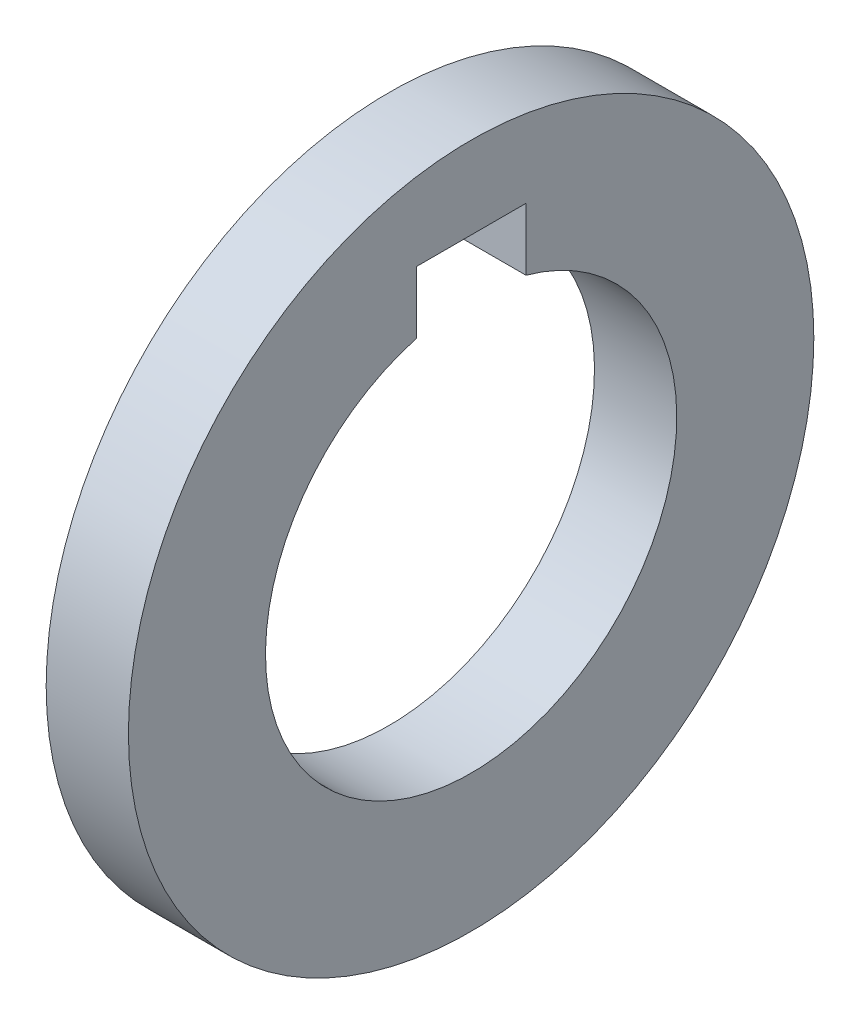
ISO-10303-21;
HEADER;
FILE_DESCRIPTION(('STEP AP214'),'2;1');
FILE_NAME('part.step','',(''),(''),'','','');
FILE_SCHEMA(('AUTOMOTIVE_DESIGN { 1 0 10303 214 1 1 1 1 }'));
ENDSEC;
DATA;
#1=APPLICATION_CONTEXT('core data for automotive mechanical design processes');
#2=APPLICATION_PROTOCOL_DEFINITION('international standard','automotive_design',2000,#1);
#3=PRODUCT_CONTEXT('',#1,'mechanical');
#4=PRODUCT('Part','Part','',(#3));
#5=PRODUCT_RELATED_PRODUCT_CATEGORY('part','',(#4));
#6=PRODUCT_DEFINITION_FORMATION('','',#4);
#7=PRODUCT_DEFINITION_CONTEXT('part definition',#1,'design');
#8=PRODUCT_DEFINITION('design','',#6,#7);
#9=PRODUCT_DEFINITION_SHAPE('','',#8);
#10=(LENGTH_UNIT() NAMED_UNIT(*) SI_UNIT(.MILLI.,.METRE.));
#11=(NAMED_UNIT(*) PLANE_ANGLE_UNIT() SI_UNIT($,.RADIAN.));
#12=(NAMED_UNIT(*) SI_UNIT($,.STERADIAN.) SOLID_ANGLE_UNIT());
#13=UNCERTAINTY_MEASURE_WITH_UNIT(LENGTH_MEASURE(1.E-05),#10,'distance_accuracy_value','');
#14=(GEOMETRIC_REPRESENTATION_CONTEXT(3) GLOBAL_UNCERTAINTY_ASSIGNED_CONTEXT((#13)) GLOBAL_UNIT_ASSIGNED_CONTEXT((#10,
#11,#12)) REPRESENTATION_CONTEXT('',''));
#15=CARTESIAN_POINT('',(0.,0.,0.));
#16=DIRECTION('',(0.,0.,1.));
#17=DIRECTION('',(1.,0.,0.));
#18=AXIS2_PLACEMENT_3D('',#15,#16,#17);
#19=CARTESIAN_POINT('',(3.,0.,0.));
#20=DIRECTION('',(1.,0.,0.));
#21=DIRECTION('',(0.,0.,-1.));
#22=AXIS2_PLACEMENT_3D('',#19,#20,#21);
#23=PLANE('',#22);
#24=DIRECTION('',(0.,-1.,0.));
#25=VECTOR('',#24,1.);
#26=CARTESIAN_POINT('',(3.,0.,2.));
#27=LINE('',#26,#25);
#28=CARTESIAN_POINT('',(3.,9.5,2.));
#29=VERTEX_POINT('',#28);
#30=CARTESIAN_POINT('',(3.,7.22841614740048,2.));
#31=VERTEX_POINT('',#30);
#32=EDGE_CURVE('E59',#29,#31,#27,.T.);
#33=ORIENTED_EDGE('',*,*,#32,.F.);
#34=DIRECTION('',(0.,0.,1.));
#35=VECTOR('',#34,1.);
#36=CARTESIAN_POINT('',(3.,9.5,0.));
#37=LINE('',#36,#35);
#38=CARTESIAN_POINT('',(3.,9.5,-2.));
#39=VERTEX_POINT('',#38);
#40=EDGE_CURVE('E103',#39,#29,#37,.T.);
#41=ORIENTED_EDGE('',*,*,#40,.F.);
#42=DIRECTION('',(0.,1.,0.));
#43=VECTOR('',#42,1.);
#44=CARTESIAN_POINT('',(3.,0.,-2.));
#45=LINE('',#44,#43);
#46=CARTESIAN_POINT('',(3.,7.22841614740048,-2.));
#47=VERTEX_POINT('',#46);
#48=EDGE_CURVE('E80',#47,#39,#45,.T.);
#49=ORIENTED_EDGE('',*,*,#48,.F.);
#50=CARTESIAN_POINT('',(3.,0.,0.));
#51=DIRECTION('',(1.,0.,0.));
#52=DIRECTION('',(0.,0.,-1.));
#53=AXIS2_PLACEMENT_3D('',#50,#51,#52);
#54=CIRCLE('',#53,7.5);
#55=EDGE_CURVE('E105',#31,#47,#54,.T.);
#56=ORIENTED_EDGE('',*,*,#55,.F.);
#57=EDGE_LOOP('',(#33,#41,#49,#56));
#58=FACE_BOUND('',#57,.T.);
#59=CARTESIAN_POINT('',(3.,0.,0.));
#60=DIRECTION('',(1.,0.,0.));
#61=DIRECTION('',(0.,0.,-1.));
#62=AXIS2_PLACEMENT_3D('',#59,#60,#61);
#63=CIRCLE('',#62,12.5);
#64=CARTESIAN_POINT('',(3.,0.,-12.5));
#65=VERTEX_POINT('',#64);
#66=EDGE_CURVE('E110',#65,#65,#63,.T.);
#67=ORIENTED_EDGE('',*,*,#66,.T.);
#68=EDGE_LOOP('',(#67));
#69=FACE_BOUND('',#68,.T.);
#70=ADVANCED_FACE('F37',(#58,#69),#23,.T.);
#71=CARTESIAN_POINT('',(0.,0.,0.));
#72=DIRECTION('',(1.,0.,0.));
#73=DIRECTION('',(0.,0.,-1.));
#74=AXIS2_PLACEMENT_3D('',#71,#72,#73);
#75=PLANE('',#74);
#76=CARTESIAN_POINT('',(0.,0.,0.));
#77=DIRECTION('',(1.,0.,0.));
#78=DIRECTION('',(0.,0.,-1.));
#79=AXIS2_PLACEMENT_3D('',#76,#77,#78);
#80=CIRCLE('',#79,12.5);
#81=CARTESIAN_POINT('',(0.,0.,-12.5));
#82=VERTEX_POINT('',#81);
#83=EDGE_CURVE('E108',#82,#82,#80,.T.);
#84=ORIENTED_EDGE('',*,*,#83,.F.);
#85=EDGE_LOOP('',(#84));
#86=FACE_BOUND('',#85,.T.);
#87=DIRECTION('',(0.,0.,-1.));
#88=VECTOR('',#87,1.);
#89=CARTESIAN_POINT('',(0.,9.5,-2.));
#90=LINE('',#89,#88);
#91=CARTESIAN_POINT('',(0.,9.5,2.));
#92=VERTEX_POINT('',#91);
#93=CARTESIAN_POINT('',(0.,9.5,-2.));
#94=VERTEX_POINT('',#93);
#95=EDGE_CURVE('E87',#92,#94,#90,.T.);
#96=ORIENTED_EDGE('',*,*,#95,.F.);
#97=DIRECTION('',(0.,1.,0.));
#98=VECTOR('',#97,1.);
#99=CARTESIAN_POINT('',(0.,9.5,2.));
#100=LINE('',#99,#98);
#101=CARTESIAN_POINT('',(0.,7.22841614740048,2.));
#102=VERTEX_POINT('',#101);
#103=EDGE_CURVE('E84',#102,#92,#100,.T.);
#104=ORIENTED_EDGE('',*,*,#103,.F.);
#105=CARTESIAN_POINT('',(0.,0.,0.));
#106=DIRECTION('',(1.,0.,0.));
#107=DIRECTION('',(0.,0.,-1.));
#108=AXIS2_PLACEMENT_3D('',#105,#106,#107);
#109=CIRCLE('',#108,7.5);
#110=CARTESIAN_POINT('',(0.,7.22841614740048,-2.));
#111=VERTEX_POINT('',#110);
#112=EDGE_CURVE('E96',#102,#111,#109,.T.);
#113=ORIENTED_EDGE('',*,*,#112,.T.);
#114=DIRECTION('',(0.,-1.,0.));
#115=VECTOR('',#114,1.);
#116=CARTESIAN_POINT('',(0.,9.5,-2.));
#117=LINE('',#116,#115);
#118=EDGE_CURVE('E52',#94,#111,#117,.T.);
#119=ORIENTED_EDGE('',*,*,#118,.F.);
#120=EDGE_LOOP('',(#96,#104,#113,#119));
#121=FACE_BOUND('',#120,.T.);
#122=ADVANCED_FACE('F94',(#86,#121),#75,.F.);
#123=CARTESIAN_POINT('',(3.,0.,0.));
#124=DIRECTION('',(-1.,0.,0.));
#125=DIRECTION('',(0.,0.,1.));
#126=AXIS2_PLACEMENT_3D('',#123,#124,#125);
#127=CYLINDRICAL_SURFACE('',#126,12.5);
#128=ORIENTED_EDGE('',*,*,#66,.F.);
#129=EDGE_LOOP('',(#128));
#130=FACE_BOUND('',#129,.T.);
#131=ORIENTED_EDGE('',*,*,#83,.T.);
#132=EDGE_LOOP('',(#131));
#133=FACE_BOUND('',#132,.T.);
#134=ADVANCED_FACE('F39',(#130,#133),#127,.T.);
#135=CARTESIAN_POINT('',(3.,0.,0.));
#136=DIRECTION('',(-1.,0.,0.));
#137=DIRECTION('',(0.,0.,1.));
#138=AXIS2_PLACEMENT_3D('',#135,#136,#137);
#139=CYLINDRICAL_SURFACE('',#138,7.5);
#140=DIRECTION('',(-1.,0.,0.));
#141=VECTOR('',#140,1.);
#142=CARTESIAN_POINT('',(3.,7.22841614740048,2.));
#143=LINE('',#142,#141);
#144=EDGE_CURVE('E11',#31,#102,#143,.T.);
#145=ORIENTED_EDGE('',*,*,#144,.F.);
#146=ORIENTED_EDGE('',*,*,#55,.T.);
#147=DIRECTION('',(-1.,0.,0.));
#148=VECTOR('',#147,1.);
#149=CARTESIAN_POINT('',(3.,7.22841614740048,-2.));
#150=LINE('',#149,#148);
#151=EDGE_CURVE('E45',#111,#47,#150,.F.);
#152=ORIENTED_EDGE('',*,*,#151,.F.);
#153=ORIENTED_EDGE('',*,*,#112,.F.);
#154=EDGE_LOOP('',(#145,#146,#152,#153));
#155=FACE_BOUND('',#154,.T.);
#156=ADVANCED_FACE('F118',(#155),#139,.F.);
#157=CARTESIAN_POINT('',(10.,9.5,-2.));
#158=DIRECTION('',(0.,1.,0.));
#159=DIRECTION('',(0.,0.,1.));
#160=AXIS2_PLACEMENT_3D('',#157,#158,#159);
#161=PLANE('',#160);
#162=ORIENTED_EDGE('',*,*,#40,.T.);
#163=DIRECTION('',(-1.,0.,0.));
#164=VECTOR('',#163,1.);
#165=CARTESIAN_POINT('',(10.,9.5,2.));
#166=LINE('',#165,#164);
#167=EDGE_CURVE('E83',#29,#92,#166,.T.);
#168=ORIENTED_EDGE('',*,*,#167,.T.);
#169=ORIENTED_EDGE('',*,*,#95,.T.);
#170=DIRECTION('',(-1.,0.,0.));
#171=VECTOR('',#170,1.);
#172=CARTESIAN_POINT('',(10.,9.5,-2.));
#173=LINE('',#172,#171);
#174=EDGE_CURVE('E76',#39,#94,#173,.T.);
#175=ORIENTED_EDGE('',*,*,#174,.F.);
#176=EDGE_LOOP('',(#162,#168,#169,#175));
#177=FACE_BOUND('',#176,.T.);
#178=ADVANCED_FACE('F88',(#177),#161,.F.);
#179=CARTESIAN_POINT('',(10.,9.5,2.));
#180=DIRECTION('',(0.,0.,1.));
#181=DIRECTION('',(0.,-1.,0.));
#182=AXIS2_PLACEMENT_3D('',#179,#180,#181);
#183=PLANE('',#182);
#184=ORIENTED_EDGE('',*,*,#32,.T.);
#185=ORIENTED_EDGE('',*,*,#144,.T.);
#186=ORIENTED_EDGE('',*,*,#103,.T.);
#187=ORIENTED_EDGE('',*,*,#167,.F.);
#188=EDGE_LOOP('',(#184,#185,#186,#187));
#189=FACE_BOUND('',#188,.T.);
#190=ADVANCED_FACE('F119',(#189),#183,.F.);
#191=CARTESIAN_POINT('',(10.,9.5,-2.));
#192=DIRECTION('',(0.,0.,-1.));
#193=DIRECTION('',(0.,1.,0.));
#194=AXIS2_PLACEMENT_3D('',#191,#192,#193);
#195=PLANE('',#194);
#196=ORIENTED_EDGE('',*,*,#48,.T.);
#197=ORIENTED_EDGE('',*,*,#174,.T.);
#198=ORIENTED_EDGE('',*,*,#118,.T.);
#199=ORIENTED_EDGE('',*,*,#151,.T.);
#200=EDGE_LOOP('',(#196,#197,#198,#199));
#201=FACE_BOUND('',#200,.T.);
#202=ADVANCED_FACE('F78',(#201),#195,.F.);
#203=CLOSED_SHELL('',(#70,#122,#134,#156,#178,#190,#202));
#204=MANIFOLD_SOLID_BREP('B2',#203);
#205=ADVANCED_BREP_SHAPE_REPRESENTATION('',(#18,#204),#14);
#206=SHAPE_DEFINITION_REPRESENTATION(#9,#205);
ENDSEC;
END-ISO-10303-21;
